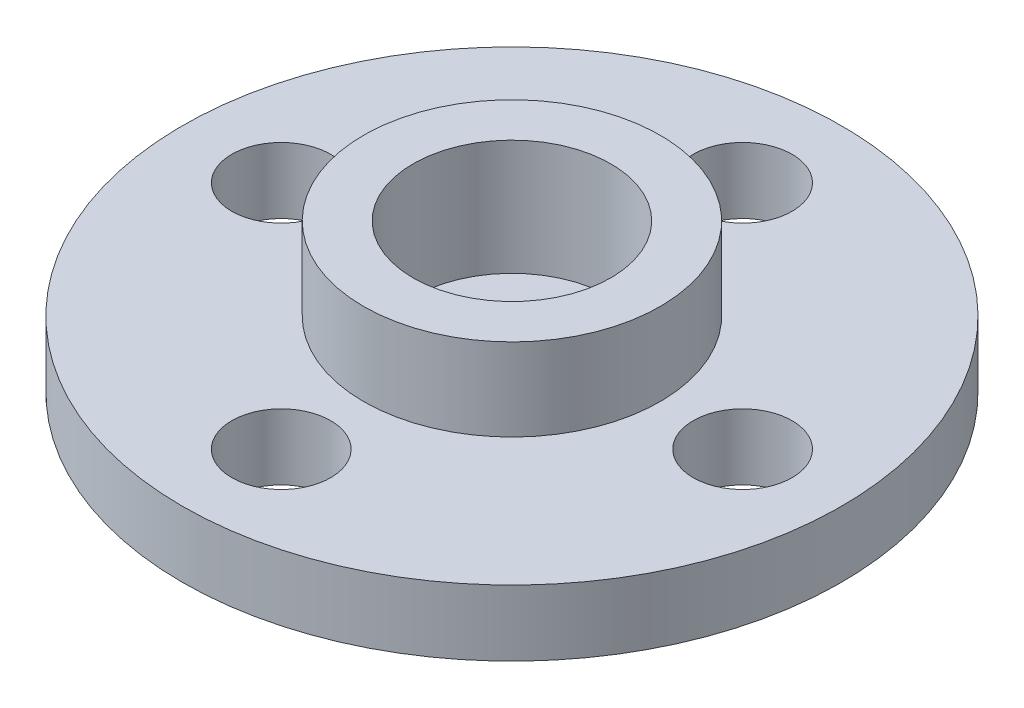
ISO-10303-21;
HEADER;
FILE_DESCRIPTION(('STEP AP214'),'2;1');
FILE_NAME('part.step','',(''),(''),'','','');
FILE_SCHEMA(('AUTOMOTIVE_DESIGN { 1 0 10303 214 1 1 1 1 }'));
ENDSEC;
DATA;
#1=APPLICATION_CONTEXT('core data for automotive mechanical design processes');
#2=APPLICATION_PROTOCOL_DEFINITION('international standard','automotive_design',2000,#1);
#3=PRODUCT_CONTEXT('',#1,'mechanical');
#4=PRODUCT('Part','Part','',(#3));
#5=PRODUCT_RELATED_PRODUCT_CATEGORY('part','',(#4));
#6=PRODUCT_DEFINITION_FORMATION('','',#4);
#7=PRODUCT_DEFINITION_CONTEXT('part definition',#1,'design');
#8=PRODUCT_DEFINITION('design','',#6,#7);
#9=PRODUCT_DEFINITION_SHAPE('','',#8);
#10=(LENGTH_UNIT() NAMED_UNIT(*) SI_UNIT(.MILLI.,.METRE.));
#11=(NAMED_UNIT(*) PLANE_ANGLE_UNIT() SI_UNIT($,.RADIAN.));
#12=(NAMED_UNIT(*) SI_UNIT($,.STERADIAN.) SOLID_ANGLE_UNIT());
#13=UNCERTAINTY_MEASURE_WITH_UNIT(LENGTH_MEASURE(1.E-05),#10,'distance_accuracy_value','');
#14=(GEOMETRIC_REPRESENTATION_CONTEXT(3) GLOBAL_UNCERTAINTY_ASSIGNED_CONTEXT((#13)) GLOBAL_UNIT_ASSIGNED_CONTEXT((#10,
#11,#12)) REPRESENTATION_CONTEXT('',''));
#15=CARTESIAN_POINT('',(0.,0.,0.));
#16=DIRECTION('',(0.,0.,1.));
#17=DIRECTION('',(1.,0.,0.));
#18=AXIS2_PLACEMENT_3D('',#15,#16,#17);
#19=CARTESIAN_POINT('',(0.,2.,0.));
#20=DIRECTION('',(0.,1.,0.));
#21=DIRECTION('',(0.,0.,1.));
#22=AXIS2_PLACEMENT_3D('',#19,#20,#21);
#23=PLANE('',#22);
#24=CARTESIAN_POINT('',(-6.9999999999998,2.,1.98523339633126E-13));
#25=DIRECTION('',(0.,1.,0.));
#26=DIRECTION('',(0.,0.,1.));
#27=AXIS2_PLACEMENT_3D('',#24,#25,#26);
#28=CIRCLE('',#27,1.5);
#29=CARTESIAN_POINT('',(-6.9999999999998,2.,1.5000000000002));
#30=VERTEX_POINT('',#29);
#31=EDGE_CURVE('E84',#30,#30,#28,.T.);
#32=ORIENTED_EDGE('',*,*,#31,.F.);
#33=EDGE_LOOP('',(#32));
#34=FACE_BOUND('',#33,.T.);
#35=CARTESIAN_POINT('',(7.0000000000002,2.,-1.97666086873723E-13));
#36=DIRECTION('',(0.,1.,0.));
#37=DIRECTION('',(0.,0.,1.));
#38=AXIS2_PLACEMENT_3D('',#35,#36,#37);
#39=CIRCLE('',#38,1.5);
#40=CARTESIAN_POINT('',(7.0000000000002,2.,1.4999999999998));
#41=VERTEX_POINT('',#40);
#42=EDGE_CURVE('E71',#41,#41,#39,.T.);
#43=ORIENTED_EDGE('',*,*,#42,.F.);
#44=EDGE_LOOP('',(#43));
#45=FACE_BOUND('',#44,.T.);
#46=CARTESIAN_POINT('',(0.,2.,-7.));
#47=DIRECTION('',(0.,1.,0.));
#48=DIRECTION('',(0.,0.,1.));
#49=AXIS2_PLACEMENT_3D('',#46,#47,#48);
#50=CIRCLE('',#49,1.5);
#51=CARTESIAN_POINT('',(0.,2.,-5.5));
#52=VERTEX_POINT('',#51);
#53=EDGE_CURVE('E58',#52,#52,#50,.T.);
#54=ORIENTED_EDGE('',*,*,#53,.F.);
#55=EDGE_LOOP('',(#54));
#56=FACE_BOUND('',#55,.T.);
#57=CARTESIAN_POINT('',(0.,2.,0.));
#58=DIRECTION('',(0.,1.,0.));
#59=DIRECTION('',(0.,0.,1.));
#60=AXIS2_PLACEMENT_3D('',#57,#58,#59);
#61=CIRCLE('',#60,10.);
#62=CARTESIAN_POINT('',(0.,2.,10.));
#63=VERTEX_POINT('',#62);
#64=EDGE_CURVE('E10',#63,#63,#61,.T.);
#65=ORIENTED_EDGE('',*,*,#64,.T.);
#66=EDGE_LOOP('',(#65));
#67=FACE_BOUND('',#66,.T.);
#68=CARTESIAN_POINT('',(3.95332173747447E-13,2.,7.));
#69=DIRECTION('',(0.,1.,0.));
#70=DIRECTION('',(0.,0.,1.));
#71=AXIS2_PLACEMENT_3D('',#68,#69,#70);
#72=CIRCLE('',#71,1.5);
#73=CARTESIAN_POINT('',(3.95332173747447E-13,2.,8.5));
#74=VERTEX_POINT('',#73);
#75=EDGE_CURVE('E76',#74,#74,#72,.T.);
#76=ORIENTED_EDGE('',*,*,#75,.F.);
#77=EDGE_LOOP('',(#76));
#78=FACE_BOUND('',#77,.T.);
#79=CARTESIAN_POINT('',(0.,2.,0.));
#80=DIRECTION('',(0.,1.,0.));
#81=DIRECTION('',(0.,0.,1.));
#82=AXIS2_PLACEMENT_3D('',#79,#80,#81);
#83=CIRCLE('',#82,4.5);
#84=CARTESIAN_POINT('',(0.,2.,4.5));
#85=VERTEX_POINT('',#84);
#86=EDGE_CURVE('E100',#85,#85,#83,.T.);
#87=ORIENTED_EDGE('',*,*,#86,.F.);
#88=EDGE_LOOP('',(#87));
#89=FACE_BOUND('',#88,.T.);
#90=ADVANCED_FACE('F43',(#34,#45,#56,#67,#78,#89),#23,.T.);
#91=CARTESIAN_POINT('',(0.,2.,0.));
#92=DIRECTION('',(0.,-1.,0.));
#93=DIRECTION('',(0.,0.,-1.));
#94=AXIS2_PLACEMENT_3D('',#91,#92,#93);
#95=CYLINDRICAL_SURFACE('',#94,1.5);
#96=CARTESIAN_POINT('',(0.,0.,0.));
#97=DIRECTION('',(0.,1.,0.));
#98=DIRECTION('',(0.,0.,1.));
#99=AXIS2_PLACEMENT_3D('',#96,#97,#98);
#100=CIRCLE('',#99,1.5);
#101=CARTESIAN_POINT('',(0.,0.,1.5));
#102=VERTEX_POINT('',#101);
#103=EDGE_CURVE('E64',#102,#102,#100,.T.);
#104=ORIENTED_EDGE('',*,*,#103,.F.);
#105=EDGE_LOOP('',(#104));
#106=FACE_BOUND('',#105,.T.);
#107=CARTESIAN_POINT('',(0.,1.,0.));
#108=DIRECTION('',(0.,1.,0.));
#109=DIRECTION('',(0.,0.,1.));
#110=AXIS2_PLACEMENT_3D('',#107,#108,#109);
#111=CIRCLE('',#110,1.5);
#112=CARTESIAN_POINT('',(0.,1.,1.5));
#113=VERTEX_POINT('',#112);
#114=EDGE_CURVE('E47',#113,#113,#111,.T.);
#115=ORIENTED_EDGE('',*,*,#114,.T.);
#116=EDGE_LOOP('',(#115));
#117=FACE_BOUND('',#116,.T.);
#118=ADVANCED_FACE('F130',(#106,#117),#95,.F.);
#119=CARTESIAN_POINT('',(0.,0.,0.));
#120=DIRECTION('',(0.,1.,0.));
#121=DIRECTION('',(0.,0.,1.));
#122=AXIS2_PLACEMENT_3D('',#119,#120,#121);
#123=PLANE('',#122);
#124=CARTESIAN_POINT('',(0.,0.,0.));
#125=DIRECTION('',(0.,1.,0.));
#126=DIRECTION('',(0.,0.,1.));
#127=AXIS2_PLACEMENT_3D('',#124,#125,#126);
#128=CIRCLE('',#127,10.);
#129=CARTESIAN_POINT('',(0.,0.,10.));
#130=VERTEX_POINT('',#129);
#131=EDGE_CURVE('E52',#130,#130,#128,.T.);
#132=ORIENTED_EDGE('',*,*,#131,.F.);
#133=EDGE_LOOP('',(#132));
#134=FACE_BOUND('',#133,.T.);
#135=CARTESIAN_POINT('',(0.,0.,-7.));
#136=DIRECTION('',(0.,1.,0.));
#137=DIRECTION('',(0.,0.,1.));
#138=AXIS2_PLACEMENT_3D('',#135,#136,#137);
#139=CIRCLE('',#138,1.5);
#140=CARTESIAN_POINT('',(0.,0.,-5.5));
#141=VERTEX_POINT('',#140);
#142=EDGE_CURVE('E60',#141,#141,#139,.T.);
#143=ORIENTED_EDGE('',*,*,#142,.T.);
#144=EDGE_LOOP('',(#143));
#145=FACE_BOUND('',#144,.T.);
#146=ORIENTED_EDGE('',*,*,#103,.T.);
#147=EDGE_LOOP('',(#146));
#148=FACE_BOUND('',#147,.T.);
#149=CARTESIAN_POINT('',(7.0000000000002,0.,-1.97666086873723E-13));
#150=DIRECTION('',(0.,1.,0.));
#151=DIRECTION('',(0.,0.,1.));
#152=AXIS2_PLACEMENT_3D('',#149,#150,#151);
#153=CIRCLE('',#152,1.5);
#154=CARTESIAN_POINT('',(7.0000000000002,0.,1.4999999999998));
#155=VERTEX_POINT('',#154);
#156=EDGE_CURVE('E72',#155,#155,#153,.T.);
#157=ORIENTED_EDGE('',*,*,#156,.T.);
#158=EDGE_LOOP('',(#157));
#159=FACE_BOUND('',#158,.T.);
#160=CARTESIAN_POINT('',(3.95332173747447E-13,0.,7.));
#161=DIRECTION('',(0.,1.,0.));
#162=DIRECTION('',(0.,0.,1.));
#163=AXIS2_PLACEMENT_3D('',#160,#161,#162);
#164=CIRCLE('',#163,1.5);
#165=CARTESIAN_POINT('',(3.95332173747447E-13,0.,8.5));
#166=VERTEX_POINT('',#165);
#167=EDGE_CURVE('E80',#166,#166,#164,.T.);
#168=ORIENTED_EDGE('',*,*,#167,.T.);
#169=EDGE_LOOP('',(#168));
#170=FACE_BOUND('',#169,.T.);
#171=CARTESIAN_POINT('',(-6.9999999999998,0.,1.98523339633126E-13));
#172=DIRECTION('',(0.,1.,0.));
#173=DIRECTION('',(0.,0.,1.));
#174=AXIS2_PLACEMENT_3D('',#171,#172,#173);
#175=CIRCLE('',#174,1.5);
#176=CARTESIAN_POINT('',(-6.9999999999998,0.,1.5000000000002));
#177=VERTEX_POINT('',#176);
#178=EDGE_CURVE('E88',#177,#177,#175,.T.);
#179=ORIENTED_EDGE('',*,*,#178,.T.);
#180=EDGE_LOOP('',(#179));
#181=FACE_BOUND('',#180,.T.);
#182=ADVANCED_FACE('F136',(#134,#145,#148,#159,#170,#181),#123,.F.);
#183=CARTESIAN_POINT('',(0.,2.,0.));
#184=DIRECTION('',(0.,-1.,0.));
#185=DIRECTION('',(0.,0.,-1.));
#186=AXIS2_PLACEMENT_3D('',#183,#184,#185);
#187=CYLINDRICAL_SURFACE('',#186,10.);
#188=ORIENTED_EDGE('',*,*,#64,.F.);
#189=EDGE_LOOP('',(#188));
#190=FACE_BOUND('',#189,.T.);
#191=ORIENTED_EDGE('',*,*,#131,.T.);
#192=EDGE_LOOP('',(#191));
#193=FACE_BOUND('',#192,.T.);
#194=ADVANCED_FACE('F45',(#190,#193),#187,.T.);
#195=CARTESIAN_POINT('',(0.,2.,-7.));
#196=DIRECTION('',(0.,-1.,0.));
#197=DIRECTION('',(0.,0.,-1.));
#198=AXIS2_PLACEMENT_3D('',#195,#196,#197);
#199=CYLINDRICAL_SURFACE('',#198,1.5);
#200=ORIENTED_EDGE('',*,*,#53,.T.);
#201=EDGE_LOOP('',(#200));
#202=FACE_BOUND('',#201,.T.);
#203=ORIENTED_EDGE('',*,*,#142,.F.);
#204=EDGE_LOOP('',(#203));
#205=FACE_BOUND('',#204,.T.);
#206=ADVANCED_FACE('F142',(#202,#205),#199,.F.);
#207=CARTESIAN_POINT('',(7.0000000000002,2.,-1.97666086873723E-13));
#208=DIRECTION('',(0.,-1.,0.));
#209=DIRECTION('',(0.,0.,-1.));
#210=AXIS2_PLACEMENT_3D('',#207,#208,#209);
#211=CYLINDRICAL_SURFACE('',#210,1.5);
#212=ORIENTED_EDGE('',*,*,#42,.T.);
#213=EDGE_LOOP('',(#212));
#214=FACE_BOUND('',#213,.T.);
#215=ORIENTED_EDGE('',*,*,#156,.F.);
#216=EDGE_LOOP('',(#215));
#217=FACE_BOUND('',#216,.T.);
#218=ADVANCED_FACE('F171',(#214,#217),#211,.F.);
#219=CARTESIAN_POINT('',(3.95332173747447E-13,2.,7.));
#220=DIRECTION('',(0.,-1.,0.));
#221=DIRECTION('',(0.,0.,-1.));
#222=AXIS2_PLACEMENT_3D('',#219,#220,#221);
#223=CYLINDRICAL_SURFACE('',#222,1.5);
#224=ORIENTED_EDGE('',*,*,#75,.T.);
#225=EDGE_LOOP('',(#224));
#226=FACE_BOUND('',#225,.T.);
#227=ORIENTED_EDGE('',*,*,#167,.F.);
#228=EDGE_LOOP('',(#227));
#229=FACE_BOUND('',#228,.T.);
#230=ADVANCED_FACE('F163',(#226,#229),#223,.F.);
#231=CARTESIAN_POINT('',(-6.9999999999998,2.,1.98523339633126E-13));
#232=DIRECTION('',(0.,-1.,0.));
#233=DIRECTION('',(0.,0.,-1.));
#234=AXIS2_PLACEMENT_3D('',#231,#232,#233);
#235=CYLINDRICAL_SURFACE('',#234,1.5);
#236=ORIENTED_EDGE('',*,*,#31,.T.);
#237=EDGE_LOOP('',(#236));
#238=FACE_BOUND('',#237,.T.);
#239=ORIENTED_EDGE('',*,*,#178,.F.);
#240=EDGE_LOOP('',(#239));
#241=FACE_BOUND('',#240,.T.);
#242=ADVANCED_FACE('F161',(#238,#241),#235,.F.);
#243=CARTESIAN_POINT('',(0.,1.,0.));
#244=DIRECTION('',(0.,1.,0.));
#245=DIRECTION('',(0.,0.,1.));
#246=AXIS2_PLACEMENT_3D('',#243,#244,#245);
#247=CYLINDRICAL_SURFACE('',#246,3.);
#248=CARTESIAN_POINT('',(0.,1.,0.));
#249=DIRECTION('',(0.,1.,0.));
#250=DIRECTION('',(0.,0.,1.));
#251=AXIS2_PLACEMENT_3D('',#248,#249,#250);
#252=CIRCLE('',#251,3.);
#253=CARTESIAN_POINT('',(0.,1.,3.));
#254=VERTEX_POINT('',#253);
#255=EDGE_CURVE('E95',#254,#254,#252,.T.);
#256=ORIENTED_EDGE('',*,*,#255,.F.);
#257=EDGE_LOOP('',(#256));
#258=FACE_BOUND('',#257,.T.);
#259=CARTESIAN_POINT('',(0.,4.5,0.));
#260=DIRECTION('',(0.,1.,0.));
#261=DIRECTION('',(0.,0.,1.));
#262=AXIS2_PLACEMENT_3D('',#259,#260,#261);
#263=CIRCLE('',#262,3.);
#264=CARTESIAN_POINT('',(0.,4.5,3.));
#265=VERTEX_POINT('',#264);
#266=EDGE_CURVE('E104',#265,#265,#263,.T.);
#267=ORIENTED_EDGE('',*,*,#266,.T.);
#268=EDGE_LOOP('',(#267));
#269=FACE_BOUND('',#268,.T.);
#270=ADVANCED_FACE('F112',(#258,#269),#247,.F.);
#271=CARTESIAN_POINT('',(0.,1.,0.));
#272=DIRECTION('',(0.,1.,0.));
#273=DIRECTION('',(0.,0.,1.));
#274=AXIS2_PLACEMENT_3D('',#271,#272,#273);
#275=PLANE('',#274);
#276=ORIENTED_EDGE('',*,*,#114,.F.);
#277=EDGE_LOOP('',(#276));
#278=FACE_BOUND('',#277,.T.);
#279=ORIENTED_EDGE('',*,*,#255,.T.);
#280=EDGE_LOOP('',(#279));
#281=FACE_BOUND('',#280,.T.);
#282=ADVANCED_FACE('F117',(#278,#281),#275,.T.);
#283=CARTESIAN_POINT('',(0.,4.5,0.));
#284=DIRECTION('',(0.,1.,0.));
#285=DIRECTION('',(0.,0.,1.));
#286=AXIS2_PLACEMENT_3D('',#283,#284,#285);
#287=PLANE('',#286);
#288=CARTESIAN_POINT('',(0.,4.5,0.));
#289=DIRECTION('',(0.,1.,0.));
#290=DIRECTION('',(0.,0.,1.));
#291=AXIS2_PLACEMENT_3D('',#288,#289,#290);
#292=CIRCLE('',#291,4.5);
#293=CARTESIAN_POINT('',(0.,4.5,4.5));
#294=VERTEX_POINT('',#293);
#295=EDGE_CURVE('E99',#294,#294,#292,.T.);
#296=ORIENTED_EDGE('',*,*,#295,.T.);
#297=EDGE_LOOP('',(#296));
#298=FACE_BOUND('',#297,.T.);
#299=ORIENTED_EDGE('',*,*,#266,.F.);
#300=EDGE_LOOP('',(#299));
#301=FACE_BOUND('',#300,.T.);
#302=ADVANCED_FACE('F114',(#298,#301),#287,.T.);
#303=CARTESIAN_POINT('',(0.,4.5,0.));
#304=DIRECTION('',(0.,-1.,0.));
#305=DIRECTION('',(0.,0.,-1.));
#306=AXIS2_PLACEMENT_3D('',#303,#304,#305);
#307=CYLINDRICAL_SURFACE('',#306,4.5);
#308=ORIENTED_EDGE('',*,*,#295,.F.);
#309=EDGE_LOOP('',(#308));
#310=FACE_BOUND('',#309,.T.);
#311=ORIENTED_EDGE('',*,*,#86,.T.);
#312=EDGE_LOOP('',(#311));
#313=FACE_BOUND('',#312,.T.);
#314=ADVANCED_FACE('F116',(#310,#313),#307,.T.);
#315=CLOSED_SHELL('',(#90,#118,#182,#194,#206,#218,#230,#242,#270,#282,#302,#314));
#316=MANIFOLD_SOLID_BREP('B2',#315);
#317=ADVANCED_BREP_SHAPE_REPRESENTATION('',(#18,#316),#14);
#318=SHAPE_DEFINITION_REPRESENTATION(#9,#317);
ENDSEC;
END-ISO-10303-21;
